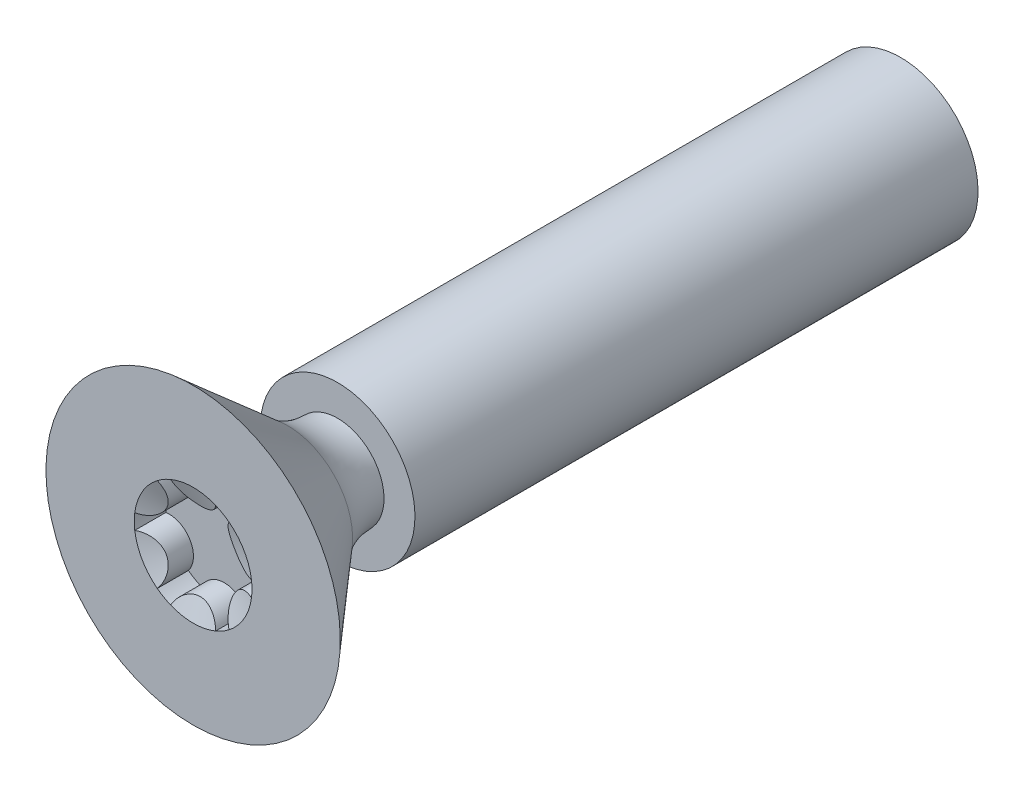
ISO-10303-21;
HEADER;
FILE_DESCRIPTION(('STEP AP214'),'2;1');
FILE_NAME('part.step','',(''),(''),'','','');
FILE_SCHEMA(('AUTOMOTIVE_DESIGN { 1 0 10303 214 1 1 1 1 }'));
ENDSEC;
DATA;
#1=APPLICATION_CONTEXT('core data for automotive mechanical design processes');
#2=APPLICATION_PROTOCOL_DEFINITION('international standard','automotive_design',2000,#1);
#3=PRODUCT_CONTEXT('',#1,'mechanical');
#4=PRODUCT('Part','Part','',(#3));
#5=PRODUCT_RELATED_PRODUCT_CATEGORY('part','',(#4));
#6=PRODUCT_DEFINITION_FORMATION('','',#4);
#7=PRODUCT_DEFINITION_CONTEXT('part definition',#1,'design');
#8=PRODUCT_DEFINITION('design','',#6,#7);
#9=PRODUCT_DEFINITION_SHAPE('','',#8);
#10=(LENGTH_UNIT() NAMED_UNIT(*) SI_UNIT(.MILLI.,.METRE.));
#11=(NAMED_UNIT(*) PLANE_ANGLE_UNIT() SI_UNIT($,.RADIAN.));
#12=(NAMED_UNIT(*) SI_UNIT($,.STERADIAN.) SOLID_ANGLE_UNIT());
#13=UNCERTAINTY_MEASURE_WITH_UNIT(LENGTH_MEASURE(1.E-05),#10,'distance_accuracy_value','');
#14=(GEOMETRIC_REPRESENTATION_CONTEXT(3) GLOBAL_UNCERTAINTY_ASSIGNED_CONTEXT((#13)) GLOBAL_UNIT_ASSIGNED_CONTEXT((#10,
#11,#12)) REPRESENTATION_CONTEXT('',''));
#15=CARTESIAN_POINT('',(0.,0.,0.));
#16=DIRECTION('',(0.,0.,1.));
#17=DIRECTION('',(1.,0.,0.));
#18=AXIS2_PLACEMENT_3D('',#15,#16,#17);
#19=CARTESIAN_POINT('',(0.,0.,-9.525));
#20=DIRECTION('',(0.,0.,1.));
#21=DIRECTION('',(0.,-1.,0.));
#22=AXIS2_PLACEMENT_3D('',#19,#20,#21);
#23=PLANE('',#22);
#24=CARTESIAN_POINT('',(0.,0.,-9.525));
#25=DIRECTION('',(0.,0.,1.));
#26=DIRECTION('',(0.,-1.,0.));
#27=AXIS2_PLACEMENT_3D('',#24,#25,#26);
#28=CIRCLE('',#27,2.08280000000001);
#29=CARTESIAN_POINT('',(0.,-2.08280000000002,-9.525));
#30=VERTEX_POINT('',#29);
#31=EDGE_CURVE('E51',#30,#30,#28,.T.);
#32=ORIENTED_EDGE('',*,*,#31,.F.);
#33=EDGE_LOOP('',(#32));
#34=FACE_BOUND('',#33,.T.);
#35=ADVANCED_FACE('F37',(#34),#23,.F.);
#36=CARTESIAN_POINT('',(0.,0.,9.525));
#37=DIRECTION('',(0.,0.,1.));
#38=DIRECTION('',(0.,-1.,0.));
#39=AXIS2_PLACEMENT_3D('',#36,#37,#38);
#40=CYLINDRICAL_SURFACE('',#39,2.08280000000001);
#41=CARTESIAN_POINT('',(0.,0.,5.63503378410079));
#42=DIRECTION('',(0.,0.,1.));
#43=DIRECTION('',(0.,-1.,0.));
#44=AXIS2_PLACEMENT_3D('',#41,#42,#43);
#45=CIRCLE('',#44,2.0828);
#46=CARTESIAN_POINT('',(0.,-2.08280000000001,5.63503378410079));
#47=VERTEX_POINT('',#46);
#48=EDGE_CURVE('E199',#47,#47,#45,.T.);
#49=ORIENTED_EDGE('',*,*,#48,.F.);
#50=EDGE_LOOP('',(#49));
#51=FACE_BOUND('',#50,.T.);
#52=ORIENTED_EDGE('',*,*,#31,.T.);
#53=EDGE_LOOP('',(#52));
#54=FACE_BOUND('',#53,.T.);
#55=ADVANCED_FACE('F204',(#51,#54),#40,.T.);
#56=CARTESIAN_POINT('',(0.,2.0828,5.63503378410079));
#57=DIRECTION('',(0.,0.,-1.));
#58=DIRECTION('',(0.,1.,0.));
#59=AXIS2_PLACEMENT_3D('',#56,#57,#58);
#60=PLANE('',#59);
#61=CARTESIAN_POINT('',(0.,0.,5.63503378410079));
#62=DIRECTION('',(0.,0.,1.));
#63=DIRECTION('',(0.,-1.,0.));
#64=AXIS2_PLACEMENT_3D('',#61,#62,#63);
#65=CIRCLE('',#64,1.24968000000001);
#66=CARTESIAN_POINT('',(0.,-1.24968000000002,5.63503378410079));
#67=VERTEX_POINT('',#66);
#68=EDGE_CURVE('E196',#67,#67,#65,.T.);
#69=ORIENTED_EDGE('',*,*,#68,.F.);
#70=EDGE_LOOP('',(#69));
#71=FACE_BOUND('',#70,.T.);
#72=ORIENTED_EDGE('',*,*,#48,.T.);
#73=EDGE_LOOP('',(#72));
#74=FACE_BOUND('',#73,.T.);
#75=ADVANCED_FACE('F210',(#71,#74),#60,.F.);
#76=CARTESIAN_POINT('',(0.,0.,5.63503378410079));
#77=DIRECTION('',(0.,0.,1.));
#78=DIRECTION('',(0.,-1.,0.));
#79=AXIS2_PLACEMENT_3D('',#76,#77,#78);
#80=TOROIDAL_SURFACE('',#79,3.30737017153296,2.05769017153295);
#81=CARTESIAN_POINT('',(0.,0.,6.985));
#82=DIRECTION('',(0.,0.,1.));
#83=DIRECTION('',(0.,-1.,0.));
#84=AXIS2_PLACEMENT_3D('',#81,#82,#83);
#85=CIRCLE('',#84,1.7544116859468);
#86=CARTESIAN_POINT('',(0.,-1.75441168594681,6.985));
#87=VERTEX_POINT('',#86);
#88=EDGE_CURVE('E193',#87,#87,#85,.T.);
#89=ORIENTED_EDGE('',*,*,#88,.F.);
#90=EDGE_LOOP('',(#89));
#91=FACE_BOUND('',#90,.T.);
#92=ORIENTED_EDGE('',*,*,#68,.T.);
#93=EDGE_LOOP('',(#92));
#94=FACE_BOUND('',#93,.T.);
#95=ADVANCED_FACE('F215',(#91,#94),#80,.F.);
#96=CARTESIAN_POINT('',(0.,0.,6.985));
#97=DIRECTION('',(0.,0.,1.));
#98=DIRECTION('',(0.,-1.,0.));
#99=AXIS2_PLACEMENT_3D('',#96,#97,#98);
#100=CONICAL_SURFACE('',#99,1.7544116859468,0.715584993317673);
#101=CARTESIAN_POINT('',(0.,0.,9.525));
#102=DIRECTION('',(0.,0.,1.));
#103=DIRECTION('',(0.,-1.,0.));
#104=AXIS2_PLACEMENT_3D('',#101,#102,#103);
#105=CIRCLE('',#104,3.96240000000001);
#106=CARTESIAN_POINT('',(0.,-3.96240000000001,9.525));
#107=VERTEX_POINT('',#106);
#108=EDGE_CURVE('E188',#107,#107,#105,.T.);
#109=ORIENTED_EDGE('',*,*,#108,.F.);
#110=EDGE_LOOP('',(#109));
#111=FACE_BOUND('',#110,.T.);
#112=ORIENTED_EDGE('',*,*,#88,.T.);
#113=EDGE_LOOP('',(#112));
#114=FACE_BOUND('',#113,.T.);
#115=ADVANCED_FACE('F222',(#111,#114),#100,.T.);
#116=CARTESIAN_POINT('',(0.,3.9624,9.525));
#117=DIRECTION('',(0.,0.,-1.));
#118=DIRECTION('',(0.,1.,0.));
#119=AXIS2_PLACEMENT_3D('',#116,#117,#118);
#120=PLANE('',#119);
#121=CARTESIAN_POINT('',(0.,0.,9.525));
#122=DIRECTION('',(0.,0.,1.));
#123=DIRECTION('',(1.,0.,0.));
#124=AXIS2_PLACEMENT_3D('',#121,#122,#123);
#125=CIRCLE('',#124,1.58496);
#126=CARTESIAN_POINT('',(0.964862514521663,1.257433310228,9.525));
#127=VERTEX_POINT('',#126);
#128=CARTESIAN_POINT('',(0.606537932961372,1.46431210384909,9.525));
#129=VERTEX_POINT('',#128);
#130=EDGE_CURVE('E147',#127,#129,#125,.T.);
#131=ORIENTED_EDGE('',*,*,#130,.F.);
#132=CARTESIAN_POINT('',(0.,0.,9.525));
#133=DIRECTION('',(0.,0.,1.));
#134=DIRECTION('',(1.,0.,0.));
#135=AXIS2_PLACEMENT_3D('',#132,#133,#134);
#136=CIRCLE('',#135,1.58496);
#137=CARTESIAN_POINT('',(1.57140044748303,0.206878793621089,9.525));
#138=VERTEX_POINT('',#137);
#139=EDGE_CURVE('E130',#138,#127,#136,.T.);
#140=ORIENTED_EDGE('',*,*,#139,.F.);
#141=CARTESIAN_POINT('',(0.,0.,9.525));
#142=DIRECTION('',(0.,0.,1.));
#143=DIRECTION('',(0.499999999999998,-0.86602540378444,0.));
#144=AXIS2_PLACEMENT_3D('',#141,#142,#143);
#145=CIRCLE('',#144,1.58496);
#146=CARTESIAN_POINT('',(1.57140044748303,-0.206878793621098,9.525));
#147=VERTEX_POINT('',#146);
#148=EDGE_CURVE('E144',#147,#138,#145,.T.);
#149=ORIENTED_EDGE('',*,*,#148,.F.);
#150=CARTESIAN_POINT('',(0.964862514521656,-1.257433310228,9.525));
#151=VERTEX_POINT('',#150);
#152=EDGE_CURVE('E152',#151,#147,#136,.T.);
#153=ORIENTED_EDGE('',*,*,#152,.F.);
#154=CARTESIAN_POINT('',(0.,0.,9.525));
#155=DIRECTION('',(0.,0.,1.));
#156=DIRECTION('',(-0.500000000000004,-0.866025403784436,0.));
#157=AXIS2_PLACEMENT_3D('',#154,#155,#156);
#158=CIRCLE('',#157,1.58496);
#159=CARTESIAN_POINT('',(0.606537932961375,-1.46431210384909,9.525));
#160=VERTEX_POINT('',#159);
#161=EDGE_CURVE('E314',#160,#151,#158,.T.);
#162=ORIENTED_EDGE('',*,*,#161,.F.);
#163=CARTESIAN_POINT('',(-0.606537932961372,-1.46431210384909,9.525));
#164=VERTEX_POINT('',#163);
#165=EDGE_CURVE('E315',#164,#160,#136,.T.);
#166=ORIENTED_EDGE('',*,*,#165,.F.);
#167=CARTESIAN_POINT('',(0.,0.,9.525));
#168=DIRECTION('',(0.,0.,1.));
#169=DIRECTION('',(-1.,0.,0.));
#170=AXIS2_PLACEMENT_3D('',#167,#168,#169);
#171=CIRCLE('',#170,1.58496);
#172=CARTESIAN_POINT('',(-0.964862514521672,-1.25743331022799,9.525));
#173=VERTEX_POINT('',#172);
#174=EDGE_CURVE('E349',#173,#164,#171,.T.);
#175=ORIENTED_EDGE('',*,*,#174,.F.);
#176=CARTESIAN_POINT('',(-1.57140044748304,-0.206878793621078,9.525));
#177=VERTEX_POINT('',#176);
#178=EDGE_CURVE('E316',#177,#173,#136,.T.);
#179=ORIENTED_EDGE('',*,*,#178,.F.);
#180=CARTESIAN_POINT('',(0.,0.,9.525));
#181=DIRECTION('',(0.,0.,1.));
#182=DIRECTION('',(-0.499999999999992,0.866025403784443,0.));
#183=AXIS2_PLACEMENT_3D('',#180,#181,#182);
#184=CIRCLE('',#183,1.58496);
#185=CARTESIAN_POINT('',(-1.57140044748303,0.206878793621109,9.525));
#186=VERTEX_POINT('',#185);
#187=EDGE_CURVE('E332',#186,#177,#184,.T.);
#188=ORIENTED_EDGE('',*,*,#187,.F.);
#189=CARTESIAN_POINT('',(-0.964862514521647,1.25743331022801,9.525));
#190=VERTEX_POINT('',#189);
#191=EDGE_CURVE('E319',#190,#186,#136,.T.);
#192=ORIENTED_EDGE('',*,*,#191,.F.);
#193=CARTESIAN_POINT('',(0.,0.,9.525));
#194=DIRECTION('',(0.,0.,1.));
#195=DIRECTION('',(1.,0.,0.));
#196=AXIS2_PLACEMENT_3D('',#193,#194,#195);
#197=CIRCLE('',#196,1.58496);
#198=CARTESIAN_POINT('',(-0.606537932961375,1.46431210384909,9.525));
#199=VERTEX_POINT('',#198);
#200=EDGE_CURVE('E178',#199,#190,#197,.T.);
#201=ORIENTED_EDGE('',*,*,#200,.F.);
#202=EDGE_CURVE('E150',#129,#199,#136,.T.);
#203=ORIENTED_EDGE('',*,*,#202,.F.);
#204=EDGE_LOOP('',(#131,#140,#149,#153,#162,#166,#175,#179,#188,#192,#201,#203));
#205=FACE_BOUND('',#204,.T.);
#206=ORIENTED_EDGE('',*,*,#108,.T.);
#207=EDGE_LOOP('',(#206));
#208=FACE_BOUND('',#207,.T.);
#209=ADVANCED_FACE('F140',(#205,#208),#120,.F.);
#210=CARTESIAN_POINT('',(0.,0.,8.6868));
#211=DIRECTION('',(0.,0.,1.));
#212=DIRECTION('',(1.,0.,0.));
#213=AXIS2_PLACEMENT_3D('',#210,#211,#212);
#214=CYLINDRICAL_SURFACE('',#213,1.58496);
#215=ORIENTED_EDGE('',*,*,#200,.T.);
#216=DIRECTION('',(0.,0.,1.));
#217=VECTOR('',#216,1.);
#218=CARTESIAN_POINT('',(-0.964862514521647,1.25743331022801,8.6868));
#219=LINE('',#218,#217);
#220=CARTESIAN_POINT('',(-0.964862514521647,1.25743331022801,8.6868));
#221=VERTEX_POINT('',#220);
#222=EDGE_CURVE('E343',#221,#190,#219,.T.);
#223=ORIENTED_EDGE('',*,*,#222,.F.);
#224=CARTESIAN_POINT('',(0.,0.,8.6868));
#225=DIRECTION('',(0.,0.,1.));
#226=DIRECTION('',(1.,0.,0.));
#227=AXIS2_PLACEMENT_3D('',#224,#225,#226);
#228=CIRCLE('',#227,1.58496);
#229=CARTESIAN_POINT('',(-0.606537932961375,1.46431210384909,8.6868));
#230=VERTEX_POINT('',#229);
#231=EDGE_CURVE('E181',#230,#221,#228,.T.);
#232=ORIENTED_EDGE('',*,*,#231,.F.);
#233=DIRECTION('',(0.,0.,1.));
#234=VECTOR('',#233,1.);
#235=CARTESIAN_POINT('',(-0.606537932961375,1.46431210384909,8.6868));
#236=LINE('',#235,#234);
#237=EDGE_CURVE('E58',#230,#199,#236,.T.);
#238=ORIENTED_EDGE('',*,*,#237,.T.);
#239=EDGE_LOOP('',(#215,#223,#232,#238));
#240=FACE_BOUND('',#239,.T.);
#241=ADVANCED_FACE('F229',(#240),#214,.F.);
#242=CARTESIAN_POINT('',(0.,1.71554834177543,8.6868));
#243=DIRECTION('',(0.,0.,1.));
#244=DIRECTION('',(1.,0.,0.));
#245=AXIS2_PLACEMENT_3D('',#242,#243,#244);
#246=CYLINDRICAL_SURFACE('',#245,0.656511927818862);
#247=DIRECTION('',(0.,0.,1.));
#248=VECTOR('',#247,1.);
#249=CARTESIAN_POINT('',(0.606537932961372,1.46431210384909,8.6868));
#250=LINE('',#249,#248);
#251=CARTESIAN_POINT('',(0.606537932961372,1.46431210384909,8.6868));
#252=VERTEX_POINT('',#251);
#253=EDGE_CURVE('E183',#252,#129,#250,.T.);
#254=ORIENTED_EDGE('',*,*,#253,.T.);
#255=CARTESIAN_POINT('',(0.606620737047647,1.4645121038491,9.52507878632848));
#256=CARTESIAN_POINT('',(0.591899974831452,1.42889640744862,9.51107584944854));
#257=CARTESIAN_POINT('',(0.574015744537299,1.39459591514082,9.49702913115426));
#258=CARTESIAN_POINT('',(0.53237347142213,1.32944028447298,9.46934068549851));
#259=CARTESIAN_POINT('',(0.508599804935802,1.29859463249072,9.45570014525806));
#260=CARTESIAN_POINT('',(0.455684489202386,1.24133009687709,9.4293816556536));
#261=CARTESIAN_POINT('',(0.426536443157783,1.2149165608469,9.41670487906433));
#262=CARTESIAN_POINT('',(0.363546962112956,1.16746668910544,9.39309530952745));
#263=CARTESIAN_POINT('',(0.329709535859555,1.14642580376133,9.38216104396763));
#264=CARTESIAN_POINT('',(0.259980041081726,1.11151189004277,9.3634686733045));
#265=CARTESIAN_POINT('',(0.224280688507839,1.09732810305881,9.35557705472131));
#266=CARTESIAN_POINT('',(0.150425702588726,1.07534624324804,9.34312947128857));
#267=CARTESIAN_POINT('',(0.112273360478411,1.06753979899499,9.33856913435916));
#268=CARTESIAN_POINT('',(0.0397175087205008,1.0593509503334,9.333771491522));
#269=CARTESIAN_POINT('',(0.00543354951431004,1.05817014081008,9.33306949651309));
#270=CARTESIAN_POINT('',(-0.0628146847864733,1.06115710753874,9.33482869448749));
#271=CARTESIAN_POINT('',(-0.0967790152509861,1.06532393956396,9.33728932904913));
#272=CARTESIAN_POINT('',(-0.161208322950086,1.07834175271004,9.34481442212741));
#273=CARTESIAN_POINT('',(-0.191758705608758,1.08687945113516,9.34970415433325));
#274=CARTESIAN_POINT('',(-0.250963101796016,1.10808251203587,9.36152878880998));
#275=CARTESIAN_POINT('',(-0.279616743541796,1.12074868087331,9.36846409059089));
#276=CARTESIAN_POINT('',(-0.336732987635439,1.15097274779104,9.38451007048393));
#277=CARTESIAN_POINT('',(-0.364992824401218,1.16884335823223,9.39375129781088));
#278=CARTESIAN_POINT('',(-0.418226123731949,1.20840337081226,9.41348967391742));
#279=CARTESIAN_POINT('',(-0.443196720684921,1.23009606482622,9.42398790280646));
#280=CARTESIAN_POINT('',(-0.492176752514586,1.27952183583867,9.44706426936941));
#281=CARTESIAN_POINT('',(-0.515725170594541,1.30766561673778,9.45974166421436));
#282=CARTESIAN_POINT('',(-0.557710344264225,1.3672777425278,9.48556895422858));
#283=CARTESIAN_POINT('',(-0.576155467677905,1.39874052683391,9.49871803549398));
#284=CARTESIAN_POINT('',(-0.597087327272507,1.44234270079717,9.51629652958411));
#285=CARTESIAN_POINT('',(-0.602009389071151,1.45336579093559,9.52068913611094));
#286=CARTESIAN_POINT('',(-0.60662073704765,1.4645121038491,9.52507878632848));
#287=B_SPLINE_CURVE_WITH_KNOTS('',3,(#255,#256,#257,#258,#259,#260,#261,#262,#263,#264,#265,
#266,#267,#268,#269,#270,#271,#272,#273,#274,#275,#276,#277,#278,#279,#280,#281,#282,#283,#284,
#285,#286),.UNSPECIFIED.,.F.,.F.,(4,2,2,2,2,2,2,2,2,2,2,2,2,2,2,4),(0.,0.122886114295661,
0.246101782428359,0.369465064653611,0.492723532130329,0.609697652485102,0.726517975105132,
0.828898189006218,0.931260328240385,1.02714137240356,1.12304115503029,1.22669481558588,
1.33043819105557,1.44642190862391,1.56221430624871,1.60073455529561),.UNSPECIFIED.);
#288=EDGE_CURVE('E135',#129,#199,#287,.T.);
#289=ORIENTED_EDGE('',*,*,#288,.T.);
#290=ORIENTED_EDGE('',*,*,#237,.F.);
#291=CARTESIAN_POINT('',(0.,1.71554834177543,8.6868));
#292=DIRECTION('',(0.,0.,-1.));
#293=DIRECTION('',(1.,0.,0.));
#294=AXIS2_PLACEMENT_3D('',#291,#292,#293);
#295=CIRCLE('',#294,0.656511927818862);
#296=EDGE_CURVE('E177',#252,#230,#295,.T.);
#297=ORIENTED_EDGE('',*,*,#296,.F.);
#298=EDGE_LOOP('',(#254,#289,#290,#297));
#299=FACE_BOUND('',#298,.T.);
#300=ADVANCED_FACE('F234',(#299),#246,.T.);
#301=CARTESIAN_POINT('',(0.,0.,8.6868));
#302=DIRECTION('',(0.,0.,1.));
#303=DIRECTION('',(1.,0.,0.));
#304=AXIS2_PLACEMENT_3D('',#301,#302,#303);
#305=CYLINDRICAL_SURFACE('',#304,1.58496);
#306=ORIENTED_EDGE('',*,*,#130,.T.);
#307=ORIENTED_EDGE('',*,*,#253,.F.);
#308=CARTESIAN_POINT('',(0.,0.,8.6868));
#309=DIRECTION('',(0.,0.,1.));
#310=DIRECTION('',(1.,0.,0.));
#311=AXIS2_PLACEMENT_3D('',#308,#309,#310);
#312=CIRCLE('',#311,1.58496);
#313=CARTESIAN_POINT('',(0.964862514521663,1.257433310228,8.6868));
#314=VERTEX_POINT('',#313);
#315=EDGE_CURVE('E174',#314,#252,#312,.T.);
#316=ORIENTED_EDGE('',*,*,#315,.F.);
#317=DIRECTION('',(0.,0.,1.));
#318=VECTOR('',#317,1.);
#319=CARTESIAN_POINT('',(0.964862514521663,1.257433310228,8.6868));
#320=LINE('',#319,#318);
#321=EDGE_CURVE('E160',#314,#127,#320,.T.);
#322=ORIENTED_EDGE('',*,*,#321,.T.);
#323=EDGE_LOOP('',(#306,#307,#316,#322));
#324=FACE_BOUND('',#323,.T.);
#325=ADVANCED_FACE('F230',(#324),#305,.F.);
#326=CARTESIAN_POINT('',(0.,0.,8.6868));
#327=DIRECTION('',(0.,0.,1.));
#328=DIRECTION('',(1.,0.,0.));
#329=AXIS2_PLACEMENT_3D('',#326,#327,#328);
#330=PLANE('',#329);
#331=CARTESIAN_POINT('',(1.48570844539779,0.857774170887714,8.6868));
#332=DIRECTION('',(0.,0.,-1.));
#333=DIRECTION('',(0.499999999999998,-0.86602540378444,0.));
#334=AXIS2_PLACEMENT_3D('',#331,#332,#333);
#335=CIRCLE('',#334,0.656511927818862);
#336=CARTESIAN_POINT('',(1.57140044748303,0.206878793621089,8.6868));
#337=VERTEX_POINT('',#336);
#338=EDGE_CURVE('E157',#337,#314,#335,.T.);
#339=ORIENTED_EDGE('',*,*,#338,.T.);
#340=ORIENTED_EDGE('',*,*,#315,.T.);
#341=ORIENTED_EDGE('',*,*,#296,.T.);
#342=ORIENTED_EDGE('',*,*,#231,.T.);
#343=CARTESIAN_POINT('',(-1.48570844539778,0.857774170887733,8.6868));
#344=DIRECTION('',(0.,0.,-1.));
#345=DIRECTION('',(0.50000000000001,0.866025403784433,0.));
#346=AXIS2_PLACEMENT_3D('',#343,#344,#345);
#347=CIRCLE('',#346,0.656511927818862);
#348=CARTESIAN_POINT('',(-1.57140044748303,0.206878793621109,8.6868));
#349=VERTEX_POINT('',#348);
#350=EDGE_CURVE('E246',#221,#349,#347,.T.);
#351=ORIENTED_EDGE('',*,*,#350,.T.);
#352=CARTESIAN_POINT('',(0.,0.,8.6868));
#353=DIRECTION('',(0.,0.,1.));
#354=DIRECTION('',(-0.499999999999992,0.866025403784443,0.));
#355=AXIS2_PLACEMENT_3D('',#352,#353,#354);
#356=CIRCLE('',#355,1.58496);
#357=CARTESIAN_POINT('',(-1.57140044748304,-0.206878793621078,8.6868));
#358=VERTEX_POINT('',#357);
#359=EDGE_CURVE('E337',#349,#358,#356,.T.);
#360=ORIENTED_EDGE('',*,*,#359,.T.);
#361=CARTESIAN_POINT('',(-1.4857084453978,-0.857774170887704,8.6868));
#362=DIRECTION('',(0.,0.,-1.));
#363=DIRECTION('',(-0.499999999999992,0.866025403784443,0.));
#364=AXIS2_PLACEMENT_3D('',#361,#362,#363);
#365=CIRCLE('',#364,0.656511927818862);
#366=CARTESIAN_POINT('',(-0.964862514521672,-1.25743331022799,8.6868));
#367=VERTEX_POINT('',#366);
#368=EDGE_CURVE('E341',#358,#367,#365,.T.);
#369=ORIENTED_EDGE('',*,*,#368,.T.);
#370=CARTESIAN_POINT('',(0.,0.,8.6868));
#371=DIRECTION('',(0.,0.,1.));
#372=DIRECTION('',(-1.,0.,0.));
#373=AXIS2_PLACEMENT_3D('',#370,#371,#372);
#374=CIRCLE('',#373,1.58496);
#375=CARTESIAN_POINT('',(-0.606537932961372,-1.46431210384909,8.6868));
#376=VERTEX_POINT('',#375);
#377=EDGE_CURVE('E352',#367,#376,#374,.T.);
#378=ORIENTED_EDGE('',*,*,#377,.T.);
#379=CARTESIAN_POINT('',(0.,-1.71554834177543,8.6868));
#380=DIRECTION('',(0.,0.,-1.));
#381=DIRECTION('',(-1.,0.,0.));
#382=AXIS2_PLACEMENT_3D('',#379,#380,#381);
#383=CIRCLE('',#382,0.656511927818862);
#384=CARTESIAN_POINT('',(0.606537932961375,-1.46431210384909,8.6868));
#385=VERTEX_POINT('',#384);
#386=EDGE_CURVE('E355',#376,#385,#383,.T.);
#387=ORIENTED_EDGE('',*,*,#386,.T.);
#388=CARTESIAN_POINT('',(0.,0.,8.6868));
#389=DIRECTION('',(0.,0.,1.));
#390=DIRECTION('',(-0.500000000000004,-0.866025403784436,0.));
#391=AXIS2_PLACEMENT_3D('',#388,#389,#390);
#392=CIRCLE('',#391,1.58496);
#393=CARTESIAN_POINT('',(0.964862514521656,-1.257433310228,8.6868));
#394=VERTEX_POINT('',#393);
#395=EDGE_CURVE('E366',#385,#394,#392,.T.);
#396=ORIENTED_EDGE('',*,*,#395,.T.);
#397=CARTESIAN_POINT('',(1.48570844539779,-0.857774170887722,8.6868));
#398=DIRECTION('',(0.,0.,-1.));
#399=DIRECTION('',(-0.500000000000004,-0.866025403784436,0.));
#400=AXIS2_PLACEMENT_3D('',#397,#398,#399);
#401=CIRCLE('',#400,0.656511927818862);
#402=CARTESIAN_POINT('',(1.57140044748303,-0.206878793621098,8.6868));
#403=VERTEX_POINT('',#402);
#404=EDGE_CURVE('E307',#394,#403,#401,.T.);
#405=ORIENTED_EDGE('',*,*,#404,.T.);
#406=CARTESIAN_POINT('',(0.,0.,8.6868));
#407=DIRECTION('',(0.,0.,1.));
#408=DIRECTION('',(0.499999999999998,-0.86602540378444,0.));
#409=AXIS2_PLACEMENT_3D('',#406,#407,#408);
#410=CIRCLE('',#409,1.58496);
#411=EDGE_CURVE('E166',#403,#337,#410,.T.);
#412=ORIENTED_EDGE('',*,*,#411,.T.);
#413=EDGE_LOOP('',(#339,#340,#341,#342,#351,#360,#369,#378,#387,#396,#405,#412));
#414=FACE_BOUND('',#413,.T.);
#415=ADVANCED_FACE('F233',(#414),#330,.T.);
#416=CARTESIAN_POINT('',(1.48570844539779,0.857774170887714,8.6868));
#417=DIRECTION('',(0.,0.,1.));
#418=DIRECTION('',(1.,0.,0.));
#419=AXIS2_PLACEMENT_3D('',#416,#417,#418);
#420=CYLINDRICAL_SURFACE('',#419,0.656511927818862);
#421=DIRECTION('',(0.,0.,1.));
#422=VECTOR('',#421,1.);
#423=CARTESIAN_POINT('',(1.57140044748303,0.206878793621089,8.6868));
#424=LINE('',#423,#422);
#425=EDGE_CURVE('E154',#337,#138,#424,.T.);
#426=ORIENTED_EDGE('',*,*,#425,.T.);
#427=CARTESIAN_POINT('',(1.57160044748303,0.206905155381347,9.52507342366894));
#428=CARTESIAN_POINT('',(1.53339596439884,0.201846733462941,9.51107052737668));
#429=CARTESIAN_POINT('',(1.49474881550115,0.20018554588693,9.49702387243406));
#430=CARTESIAN_POINT('',(1.41750149278717,0.203672687421221,9.46933560847295));
#431=CARTESIAN_POINT('',(1.37890172297067,0.208839292110661,9.45569518686263));
#432=CARTESIAN_POINT('',(1.30285200415728,0.22603465566034,9.42937700654536));
#433=CARTESIAN_POINT('',(1.26540348818721,0.238071628754191,9.41670042079987));
#434=CARTESIAN_POINT('',(1.19281668128308,0.268898714580023,9.39309132774576));
#435=CARTESIAN_POINT('',(1.15767645421489,0.287683079955932,9.38215734751313));
#436=CARTESIAN_POINT('',(1.09257644913887,0.330614918381839,9.3634656723702));
#437=CARTESIAN_POINT('',(1.06244388605663,0.354440097313536,9.35557444955442));
#438=CARTESIAN_POINT('',(1.00648089477467,0.40741036260654,9.34312771634253));
#439=CARTESIAN_POINT('',(0.980644862267754,0.436548413230223,9.33856783383223));
#440=CARTESIAN_POINT('',(0.93727661096769,0.49528968327666,9.33377104513734));
#441=CARTESIAN_POINT('',(0.919112716002118,0.524390183661399,9.33306944549036));
#442=CARTESIAN_POINT('',(0.887576760577468,0.584988465380296,9.33482936967582));
#443=CARTESIAN_POINT('',(0.874203855084532,0.616485822767858,9.33729033534397));
#444=CARTESIAN_POINT('',(0.85326412257871,0.678792219951655,9.3448160081291));
#445=CARTESIAN_POINT('',(0.845383324903808,0.70951860001507,9.3497060165735));
#446=CARTESIAN_POINT('',(0.834144579449489,0.771392804366783,9.36153114877431));
#447=CARTESIAN_POINT('',(0.83078751598219,0.8025407098544,9.36846667207077));
#448=CARTESIAN_POINT('',(0.828405297309912,0.867117064853005,9.38451310470694));
#449=CARTESIAN_POINT('',(0.829752371031226,0.900526262889412,9.39375456921559));
#450=CARTESIAN_POINT('',(0.837396914388823,0.966407880385732,9.41349337549271));
#451=CARTESIAN_POINT('',(0.843698667290685,0.99887946409618,9.42399179722682));
#452=CARTESIAN_POINT('',(0.862013970653221,1.06601029481467,9.44706851372376));
#453=CARTESIAN_POINT('',(0.87461370499383,1.10047563292125,9.45974605937357));
#454=CARTESIAN_POINT('',(0.905248169778303,1.16664165121236,9.48557360645127));
#455=CARTESIAN_POINT('',(0.923273902695396,1.19834679706288,9.49872279423692));
#456=CARTESIAN_POINT('',(0.950573693507944,1.23828117050207,9.51630409148055));
#457=CARTESIAN_POINT('',(0.957663674476363,1.24806111148701,9.52069941280622));
#458=CARTESIAN_POINT('',(0.96501604094533,1.257633310228,9.52509176840957));
#459=B_SPLINE_CURVE_WITH_KNOTS('',3,(#427,#428,#429,#430,#431,#432,#433,#434,#435,#436,#437,
#438,#439,#440,#441,#442,#443,#444,#445,#446,#447,#448,#449,#450,#451,#452,#453,#454,#455,#456,
#457,#458),.UNSPECIFIED.,.F.,.F.,(4,2,2,2,2,2,2,2,2,2,2,2,2,2,2,4),(0.,0.122885766375418,
0.246101121500331,0.36946410279625,0.492722253046518,0.609695634783576,0.726515221292399,
0.828894637308939,0.931255986762043,1.0271371247448,1.12303700312084,1.22669136933226,
1.33043544225961,1.44641977793977,1.56221283518298,1.60075683029764),.UNSPECIFIED.);
#460=EDGE_CURVE('E127',#138,#127,#459,.T.);
#461=ORIENTED_EDGE('',*,*,#460,.T.);
#462=ORIENTED_EDGE('',*,*,#321,.F.);
#463=ORIENTED_EDGE('',*,*,#338,.F.);
#464=EDGE_LOOP('',(#426,#461,#462,#463));
#465=FACE_BOUND('',#464,.T.);
#466=ADVANCED_FACE('F155',(#465),#420,.T.);
#467=CARTESIAN_POINT('',(0.,0.,8.6868));
#468=DIRECTION('',(0.,0.,1.));
#469=DIRECTION('',(1.,0.,0.));
#470=AXIS2_PLACEMENT_3D('',#467,#468,#469);
#471=CYLINDRICAL_SURFACE('',#470,1.58496);
#472=ORIENTED_EDGE('',*,*,#148,.T.);
#473=ORIENTED_EDGE('',*,*,#425,.F.);
#474=ORIENTED_EDGE('',*,*,#411,.F.);
#475=DIRECTION('',(0.,0.,1.));
#476=VECTOR('',#475,1.);
#477=CARTESIAN_POINT('',(1.57140044748303,-0.206878793621098,8.6868));
#478=LINE('',#477,#476);
#479=EDGE_CURVE('E165',#403,#147,#478,.T.);
#480=ORIENTED_EDGE('',*,*,#479,.T.);
#481=EDGE_LOOP('',(#472,#473,#474,#480));
#482=FACE_BOUND('',#481,.T.);
#483=ADVANCED_FACE('F163',(#482),#471,.F.);
#484=CARTESIAN_POINT('',(1.48570844539779,-0.857774170887722,8.6868));
#485=DIRECTION('',(0.,0.,1.));
#486=DIRECTION('',(0.,-1.,0.));
#487=AXIS2_PLACEMENT_3D('',#484,#485,#486);
#488=CYLINDRICAL_SURFACE('',#487,0.656511927818862);
#489=DIRECTION('',(0.,0.,1.));
#490=VECTOR('',#489,1.);
#491=CARTESIAN_POINT('',(0.964862514521656,-1.257433310228,8.6868));
#492=LINE('',#491,#490);
#493=EDGE_CURVE('E169',#394,#151,#492,.T.);
#494=ORIENTED_EDGE('',*,*,#493,.T.);
#495=CARTESIAN_POINT('',(0.965016040945324,-1.257633310228,9.52509176840957));
#496=CARTESIAN_POINT('',(0.941530500577438,-1.22707797248408,9.51108873330924));
#497=CARTESIAN_POINT('',(0.920765635951473,-1.19444043653207,9.49704186168867));
#498=CARTESIAN_POINT('',(0.885156500337642,-1.1258008871399,9.46935297627336));
#499=CARTESIAN_POINT('',(0.870328252169463,-1.08979008788569,9.45571214890425));
#500=CARTESIAN_POINT('',(0.847189380467055,-1.01533276823965,9.42939291067599));
#501=CARTESIAN_POINT('',(0.83888658481949,-0.97688338207782,9.41671567214001));
#502=CARTESIAN_POINT('',(0.829284440243286,-0.898608282603415,9.3931049492263));
#503=CARTESIAN_POINT('',(0.827979149150365,-0.858783765965396,9.38216999299136));
#504=CARTESIAN_POINT('',(0.832603568246803,-0.780938585388116,9.36347593868757));
#505=CARTESIAN_POINT('',(0.838167855171811,-0.74292945553158,9.3555833620559));
#506=CARTESIAN_POINT('',(0.856054974655709,-0.667976490915368,9.34313372040413));
#507=CARTESIAN_POINT('',(0.868368911248832,-0.631031321181975,9.33857228339401));
#508=CARTESIAN_POINT('',(0.89755234678354,-0.564099282486951,9.33377257274649));
#509=CARTESIAN_POINT('',(0.913670610164055,-0.533816791320206,9.3330696205974));
#510=CARTESIAN_POINT('',(0.950379658402857,-0.476202805619278,9.33482706048568));
#511=CARTESIAN_POINT('',(0.97096965224976,-0.448870790449264,9.33728689343122));
#512=CARTESIAN_POINT('',(1.01445649866512,-0.399579928332219,9.34481058290952));
#513=CARTESIAN_POINT('',(1.03712465277384,-0.377390409115796,9.34969964615135));
#514=CARTESIAN_POINT('',(1.08508761175442,-0.336717396029307,9.36152307551221));
#515=CARTESIAN_POINT('',(1.11038292916304,-0.318234627383338,9.3684578412175));
#516=CARTESIAN_POINT('',(1.16511411695806,-0.283880492218792,9.38450272677297));
#517=CARTESIAN_POINT('',(1.19471940202065,-0.268341012115795,9.39374338166316));
#518=CARTESIAN_POINT('',(1.25559408923867,-0.242017346993275,9.41348071637655));
#519=CARTESIAN_POINT('',(1.28686490937233,-0.231237288912695,9.42397847626109));
#520=CARTESIAN_POINT('',(1.35415725878211,-0.213529399977928,9.44705398767587));
#521=CARTESIAN_POINT('',(1.39030398321124,-0.207206169296688,9.45973101139824));
#522=CARTESIAN_POINT('',(1.46292100150314,-0.20064865803405,9.48555767189346));
#523=CARTESIAN_POINT('',(1.49939066344236,-0.200404353045098,9.49870649477777));
#524=CARTESIAN_POINT('',(1.54762275608162,-0.20407595368691,9.51628690588743));
#525=CARTESIAN_POINT('',(1.55963594298234,-0.205325044543862,9.52068164319188));
#526=CARTESIAN_POINT('',(1.57160044748303,-0.206905155381355,9.52507342366894));
#527=B_SPLINE_CURVE_WITH_KNOTS('',3,(#495,#496,#497,#498,#499,#500,#501,#502,#503,#504,#505,
#506,#507,#508,#509,#510,#511,#512,#513,#514,#515,#516,#517,#518,#519,#520,#521,#522,#523,#524,
#525,#526),.UNSPECIFIED.,.F.,.F.,(4,2,2,2,2,2,2,2,2,2,2,2,2,2,2,4),(0.,0.122886956465848,
0.246103382136821,0.369467392708654,0.492726628004529,0.609702536192569,0.726524640812616,
0.828906787172915,0.931270837725023,1.02715165149929,1.12305120605067,1.22670317480045,
1.33044484545505,1.44642699248326,1.56221786730978,1.60075681393548),.UNSPECIFIED.);
#528=EDGE_CURVE('E136',#151,#147,#527,.T.);
#529=ORIENTED_EDGE('',*,*,#528,.T.);
#530=ORIENTED_EDGE('',*,*,#479,.F.);
#531=ORIENTED_EDGE('',*,*,#404,.F.);
#532=EDGE_LOOP('',(#494,#529,#530,#531));
#533=FACE_BOUND('',#532,.T.);
#534=ADVANCED_FACE('F285',(#533),#488,.T.);
#535=CARTESIAN_POINT('',(0.,0.,8.6868));
#536=DIRECTION('',(0.,0.,1.));
#537=DIRECTION('',(0.,-1.,0.));
#538=AXIS2_PLACEMENT_3D('',#535,#536,#537);
#539=CYLINDRICAL_SURFACE('',#538,1.58496);
#540=ORIENTED_EDGE('',*,*,#161,.T.);
#541=ORIENTED_EDGE('',*,*,#493,.F.);
#542=ORIENTED_EDGE('',*,*,#395,.F.);
#543=DIRECTION('',(0.,0.,1.));
#544=VECTOR('',#543,1.);
#545=CARTESIAN_POINT('',(0.606537932961375,-1.46431210384909,8.6868));
#546=LINE('',#545,#544);
#547=EDGE_CURVE('E361',#385,#160,#546,.T.);
#548=ORIENTED_EDGE('',*,*,#547,.T.);
#549=EDGE_LOOP('',(#540,#541,#542,#548));
#550=FACE_BOUND('',#549,.T.);
#551=ADVANCED_FACE('F290',(#550),#539,.F.);
#552=CARTESIAN_POINT('',(0.,-1.71554834177543,8.6868));
#553=DIRECTION('',(0.,0.,1.));
#554=DIRECTION('',(0.,-1.,0.));
#555=AXIS2_PLACEMENT_3D('',#552,#553,#554);
#556=CYLINDRICAL_SURFACE('',#555,0.656511927818862);
#557=DIRECTION('',(0.,0.,1.));
#558=VECTOR('',#557,1.);
#559=CARTESIAN_POINT('',(-0.606537932961372,-1.46431210384909,8.6868));
#560=LINE('',#559,#558);
#561=EDGE_CURVE('E358',#376,#164,#560,.T.);
#562=ORIENTED_EDGE('',*,*,#561,.T.);
#563=CARTESIAN_POINT('',(-0.606620737047647,-1.4645121038491,9.52507878632848));
#564=CARTESIAN_POINT('',(-0.591899974831452,-1.42889640744862,9.51107584944854));
#565=CARTESIAN_POINT('',(-0.574015744537299,-1.39459591514082,9.49702913115426));
#566=CARTESIAN_POINT('',(-0.53237347142213,-1.32944028447298,9.46934068549851));
#567=CARTESIAN_POINT('',(-0.508599804935802,-1.29859463249072,9.45570014525806));
#568=CARTESIAN_POINT('',(-0.455684489202386,-1.24133009687709,9.4293816556536));
#569=CARTESIAN_POINT('',(-0.426536443157783,-1.2149165608469,9.41670487906433));
#570=CARTESIAN_POINT('',(-0.363546962112956,-1.16746668910544,9.39309530952745));
#571=CARTESIAN_POINT('',(-0.329709535859555,-1.14642580376133,9.38216104396763));
#572=CARTESIAN_POINT('',(-0.259980041081726,-1.11151189004277,9.3634686733045));
#573=CARTESIAN_POINT('',(-0.224280688507839,-1.09732810305881,9.35557705472131));
#574=CARTESIAN_POINT('',(-0.150425702588726,-1.07534624324804,9.34312947128857));
#575=CARTESIAN_POINT('',(-0.112273360478411,-1.06753979899499,9.33856913435916));
#576=CARTESIAN_POINT('',(-0.0397175087205008,-1.0593509503334,9.333771491522));
#577=CARTESIAN_POINT('',(-0.00543354951431004,-1.05817014081008,9.33306949651309));
#578=CARTESIAN_POINT('',(0.0628146847864733,-1.06115710753874,9.33482869448749));
#579=CARTESIAN_POINT('',(0.0967790152509861,-1.06532393956396,9.33728932904913));
#580=CARTESIAN_POINT('',(0.161208322950086,-1.07834175271004,9.34481442212741));
#581=CARTESIAN_POINT('',(0.191758705608758,-1.08687945113516,9.34970415433325));
#582=CARTESIAN_POINT('',(0.250963101796016,-1.10808251203587,9.36152878880998));
#583=CARTESIAN_POINT('',(0.279616743541796,-1.12074868087331,9.36846409059089));
#584=CARTESIAN_POINT('',(0.336732987635439,-1.15097274779104,9.38451007048393));
#585=CARTESIAN_POINT('',(0.364992824401218,-1.16884335823223,9.39375129781088));
#586=CARTESIAN_POINT('',(0.418226123731949,-1.20840337081226,9.41348967391742));
#587=CARTESIAN_POINT('',(0.443196720684921,-1.23009606482622,9.42398790280646));
#588=CARTESIAN_POINT('',(0.492176752514586,-1.27952183583867,9.44706426936941));
#589=CARTESIAN_POINT('',(0.515725170594541,-1.30766561673778,9.45974166421436));
#590=CARTESIAN_POINT('',(0.557710344264225,-1.3672777425278,9.48556895422858));
#591=CARTESIAN_POINT('',(0.576155467677905,-1.39874052683391,9.49871803549398));
#592=CARTESIAN_POINT('',(0.597087327272507,-1.44234270079717,9.51629652958411));
#593=CARTESIAN_POINT('',(0.602009389071151,-1.45336579093559,9.52068913611094));
#594=CARTESIAN_POINT('',(0.60662073704765,-1.4645121038491,9.52507878632848));
#595=B_SPLINE_CURVE_WITH_KNOTS('',3,(#563,#564,#565,#566,#567,#568,#569,#570,#571,#572,#573,
#574,#575,#576,#577,#578,#579,#580,#581,#582,#583,#584,#585,#586,#587,#588,#589,#590,#591,#592,
#593,#594),.UNSPECIFIED.,.F.,.F.,(4,2,2,2,2,2,2,2,2,2,2,2,2,2,2,4),(0.,0.122886114295661,
0.246101782428359,0.369465064653611,0.492723532130329,0.609697652485102,0.726517975105132,
0.828898189006218,0.931260328240385,1.02714137240356,1.12304115503029,1.22669481558588,
1.33043819105557,1.44642190862391,1.56221430624871,1.60073455529561),.UNSPECIFIED.);
#596=EDGE_CURVE('E273',#164,#160,#595,.T.);
#597=ORIENTED_EDGE('',*,*,#596,.T.);
#598=ORIENTED_EDGE('',*,*,#547,.F.);
#599=ORIENTED_EDGE('',*,*,#386,.F.);
#600=EDGE_LOOP('',(#562,#597,#598,#599));
#601=FACE_BOUND('',#600,.T.);
#602=ADVANCED_FACE('F294',(#601),#556,.T.);
#603=CARTESIAN_POINT('',(0.,0.,8.6868));
#604=DIRECTION('',(0.,0.,1.));
#605=DIRECTION('',(0.,-1.,0.));
#606=AXIS2_PLACEMENT_3D('',#603,#604,#605);
#607=CYLINDRICAL_SURFACE('',#606,1.58496);
#608=ORIENTED_EDGE('',*,*,#174,.T.);
#609=ORIENTED_EDGE('',*,*,#561,.F.);
#610=ORIENTED_EDGE('',*,*,#377,.F.);
#611=DIRECTION('',(0.,0.,1.));
#612=VECTOR('',#611,1.);
#613=CARTESIAN_POINT('',(-0.964862514521672,-1.25743331022799,8.6868));
#614=LINE('',#613,#612);
#615=EDGE_CURVE('E346',#367,#173,#614,.T.);
#616=ORIENTED_EDGE('',*,*,#615,.T.);
#617=EDGE_LOOP('',(#608,#609,#610,#616));
#618=FACE_BOUND('',#617,.T.);
#619=ADVANCED_FACE('F292',(#618),#607,.F.);
#620=CARTESIAN_POINT('',(-1.4857084453978,-0.857774170887704,8.6868));
#621=DIRECTION('',(0.,0.,1.));
#622=DIRECTION('',(0.,-1.,0.));
#623=AXIS2_PLACEMENT_3D('',#620,#621,#622);
#624=CYLINDRICAL_SURFACE('',#623,0.656511927818862);
#625=DIRECTION('',(0.,0.,1.));
#626=VECTOR('',#625,1.);
#627=CARTESIAN_POINT('',(-1.57140044748304,-0.206878793621078,8.6868));
#628=LINE('',#627,#626);
#629=EDGE_CURVE('E350',#358,#177,#628,.T.);
#630=ORIENTED_EDGE('',*,*,#629,.T.);
#631=CARTESIAN_POINT('',(-1.57160044748304,-0.206905155381336,9.52507342366894));
#632=CARTESIAN_POINT('',(-1.53339596439884,-0.201846733462931,9.51107052737668));
#633=CARTESIAN_POINT('',(-1.49474881550115,-0.20018554588692,9.49702387243406));
#634=CARTESIAN_POINT('',(-1.41750149278717,-0.203672687421211,9.46933560847295));
#635=CARTESIAN_POINT('',(-1.37890172297067,-0.208839292110652,9.45569518686263));
#636=CARTESIAN_POINT('',(-1.30285200415728,-0.226034655660331,9.42937700654536));
#637=CARTESIAN_POINT('',(-1.26540348818721,-0.238071628754182,9.41670042079987));
#638=CARTESIAN_POINT('',(-1.19281668128308,-0.268898714580015,9.39309132774576));
#639=CARTESIAN_POINT('',(-1.15767645421489,-0.287683079955924,9.38215734751313));
#640=CARTESIAN_POINT('',(-1.09257644913887,-0.330614918381832,9.3634656723702));
#641=CARTESIAN_POINT('',(-1.06244388605663,-0.354440097313529,9.35557444955442));
#642=CARTESIAN_POINT('',(-1.00648089477468,-0.407410362606533,9.34312771634253));
#643=CARTESIAN_POINT('',(-0.980644862267757,-0.436548413230217,9.33856783383223));
#644=CARTESIAN_POINT('',(-0.937276610967692,-0.495289683276654,9.33377104513734));
#645=CARTESIAN_POINT('',(-0.919112716002121,-0.524390183661393,9.33306944549036));
#646=CARTESIAN_POINT('',(-0.887576760577472,-0.584988465380291,9.33482936967582));
#647=CARTESIAN_POINT('',(-0.874203855084536,-0.616485822767852,9.33729033534397));
#648=CARTESIAN_POINT('',(-0.853264122578714,-0.67879221995165,9.3448160081291));
#649=CARTESIAN_POINT('',(-0.845383324903813,-0.709518600015066,9.3497060165735));
#650=CARTESIAN_POINT('',(-0.834144579449494,-0.771392804366779,9.36153114877431));
#651=CARTESIAN_POINT('',(-0.830787515982196,-0.802540709854395,9.36846667207077));
#652=CARTESIAN_POINT('',(-0.828405297309918,-0.867117064853,9.38451310470694));
#653=CARTESIAN_POINT('',(-0.829752371031232,-0.900526262889407,9.39375456921559));
#654=CARTESIAN_POINT('',(-0.83739691438883,-0.966407880385727,9.41349337549271));
#655=CARTESIAN_POINT('',(-0.843698667290692,-0.998879464096175,9.42399179722682));
#656=CARTESIAN_POINT('',(-0.862013970653228,-1.06601029481467,9.44706851372376));
#657=CARTESIAN_POINT('',(-0.874613704993838,-1.10047563292124,9.45974605937357));
#658=CARTESIAN_POINT('',(-0.905248169778311,-1.16664165121236,9.48557360645127));
#659=CARTESIAN_POINT('',(-0.923273902695404,-1.19834679706287,9.49872279423692));
#660=CARTESIAN_POINT('',(-0.950573693507953,-1.23828117050207,9.51630409148055));
#661=CARTESIAN_POINT('',(-0.957663674476372,-1.248061111487,9.52069941280622));
#662=CARTESIAN_POINT('',(-0.965016040945339,-1.25763331022799,9.52509176840957));
#663=B_SPLINE_CURVE_WITH_KNOTS('',3,(#631,#632,#633,#634,#635,#636,#637,#638,#639,#640,#641,
#642,#643,#644,#645,#646,#647,#648,#649,#650,#651,#652,#653,#654,#655,#656,#657,#658,#659,#660,
#661,#662),.UNSPECIFIED.,.F.,.F.,(4,2,2,2,2,2,2,2,2,2,2,2,2,2,2,4),(0.,0.122885766375419,
0.246101121500332,0.36946410279625,0.492722253046519,0.609695634783577,0.7265152212924,
0.828894637308939,0.931255986762043,1.0271371247448,1.12303700312084,1.22669136933226,
1.33043544225961,1.44641977793977,1.56221283518298,1.60075683029764),.UNSPECIFIED.);
#664=EDGE_CURVE('E149',#177,#173,#663,.T.);
#665=ORIENTED_EDGE('',*,*,#664,.T.);
#666=ORIENTED_EDGE('',*,*,#615,.F.);
#667=ORIENTED_EDGE('',*,*,#368,.F.);
#668=EDGE_LOOP('',(#630,#665,#666,#667));
#669=FACE_BOUND('',#668,.T.);
#670=ADVANCED_FACE('F378',(#669),#624,.T.);
#671=CARTESIAN_POINT('',(0.,0.,8.6868));
#672=DIRECTION('',(0.,0.,1.));
#673=DIRECTION('',(0.,-1.,0.));
#674=AXIS2_PLACEMENT_3D('',#671,#672,#673);
#675=CYLINDRICAL_SURFACE('',#674,1.58496);
#676=ORIENTED_EDGE('',*,*,#187,.T.);
#677=ORIENTED_EDGE('',*,*,#629,.F.);
#678=ORIENTED_EDGE('',*,*,#359,.F.);
#679=DIRECTION('',(0.,0.,1.));
#680=VECTOR('',#679,1.);
#681=CARTESIAN_POINT('',(-1.57140044748303,0.206878793621109,8.6868));
#682=LINE('',#681,#680);
#683=EDGE_CURVE('E338',#349,#186,#682,.T.);
#684=ORIENTED_EDGE('',*,*,#683,.T.);
#685=EDGE_LOOP('',(#676,#677,#678,#684));
#686=FACE_BOUND('',#685,.T.);
#687=ADVANCED_FACE('F389',(#686),#675,.F.);
#688=CARTESIAN_POINT('',(-1.48570844539778,0.857774170887733,8.6868));
#689=DIRECTION('',(0.,0.,1.));
#690=DIRECTION('',(1.,0.,0.));
#691=AXIS2_PLACEMENT_3D('',#688,#689,#690);
#692=CYLINDRICAL_SURFACE('',#691,0.656511927818862);
#693=ORIENTED_EDGE('',*,*,#222,.T.);
#694=CARTESIAN_POINT('',(-0.965016040945315,1.25763331022801,9.52509176840957));
#695=CARTESIAN_POINT('',(-0.94153050057743,1.22707797248409,9.51108873330924));
#696=CARTESIAN_POINT('',(-0.920765635951464,1.19444043653207,9.49704186168867));
#697=CARTESIAN_POINT('',(-0.885156500337634,1.12580088713991,9.46935297627336));
#698=CARTESIAN_POINT('',(-0.870328252169455,1.0897900878857,9.45571214890425));
#699=CARTESIAN_POINT('',(-0.847189380467047,1.01533276823966,9.42939291067599));
#700=CARTESIAN_POINT('',(-0.838886584819483,0.976883382077826,9.41671567214001));
#701=CARTESIAN_POINT('',(-0.82928444024328,0.89860828260342,9.3931049492263));
#702=CARTESIAN_POINT('',(-0.827979149150359,0.858783765965402,9.38216999299136));
#703=CARTESIAN_POINT('',(-0.832603568246797,0.780938585388122,9.36347593868757));
#704=CARTESIAN_POINT('',(-0.838167855171805,0.742929455531586,9.3555833620559));
#705=CARTESIAN_POINT('',(-0.856054974655704,0.667976490915374,9.34313372040413));
#706=CARTESIAN_POINT('',(-0.868368911248827,0.631031321181981,9.338572283394));
#707=CARTESIAN_POINT('',(-0.897552346783535,0.564099282486957,9.33377257274649));
#708=CARTESIAN_POINT('',(-0.913670610164051,0.533816791320213,9.3330696205974));
#709=CARTESIAN_POINT('',(-0.950379658402853,0.476202805619285,9.33482706048568));
#710=CARTESIAN_POINT('',(-0.970969652249756,0.448870790449271,9.33728689343122));
#711=CARTESIAN_POINT('',(-1.01445649866512,0.399579928332226,9.34481058290952));
#712=CARTESIAN_POINT('',(-1.03712465277384,0.377390409115803,9.34969964615135));
#713=CARTESIAN_POINT('',(-1.08508761175442,0.336717396029315,9.36152307551221));
#714=CARTESIAN_POINT('',(-1.11038292916304,0.318234627383346,9.3684578412175));
#715=CARTESIAN_POINT('',(-1.16511411695806,0.2838804922188,9.38450272677297));
#716=CARTESIAN_POINT('',(-1.19471940202065,0.268341012115803,9.39374338166316));
#717=CARTESIAN_POINT('',(-1.25559408923867,0.242017346993284,9.41348071637655));
#718=CARTESIAN_POINT('',(-1.28686490937233,0.231237288912704,9.42397847626109));
#719=CARTESIAN_POINT('',(-1.35415725878211,0.213529399977938,9.44705398767587));
#720=CARTESIAN_POINT('',(-1.39030398321124,0.207206169296698,9.45973101139824));
#721=CARTESIAN_POINT('',(-1.46292100150314,0.200648658034061,9.48555767189346));
#722=CARTESIAN_POINT('',(-1.49939066344236,0.200404353045108,9.49870649477777));
#723=CARTESIAN_POINT('',(-1.54762275608162,0.204075953686921,9.51628690588743));
#724=CARTESIAN_POINT('',(-1.55963594298234,0.205325044543873,9.52068164319188));
#725=CARTESIAN_POINT('',(-1.57160044748303,0.206905155381366,9.52507342366894));
#726=B_SPLINE_CURVE_WITH_KNOTS('',3,(#694,#695,#696,#697,#698,#699,#700,#701,#702,#703,#704,
#705,#706,#707,#708,#709,#710,#711,#712,#713,#714,#715,#716,#717,#718,#719,#720,#721,#722,#723,
#724,#725),.UNSPECIFIED.,.F.,.F.,(4,2,2,2,2,2,2,2,2,2,2,2,2,2,2,4),(0.,0.122886956465848,
0.246103382136821,0.369467392708654,0.492726628004529,0.609702536192568,0.726524640812616,
0.828906787172915,0.931270837725023,1.02715165149929,1.12305120605067,1.22670317480045,
1.33044484545505,1.44642699248326,1.56221786730978,1.60075681393548),.UNSPECIFIED.);
#727=EDGE_CURVE('E11',#190,#186,#726,.T.);
#728=ORIENTED_EDGE('',*,*,#727,.T.);
#729=ORIENTED_EDGE('',*,*,#683,.F.);
#730=ORIENTED_EDGE('',*,*,#350,.F.);
#731=EDGE_LOOP('',(#693,#728,#729,#730));
#732=FACE_BOUND('',#731,.T.);
#733=ADVANCED_FACE('F259',(#732),#692,.T.);
#734=CARTESIAN_POINT('',(0.,0.,9.525));
#735=DIRECTION('',(0.,0.,1.));
#736=DIRECTION('',(1.,0.,0.));
#737=AXIS2_PLACEMENT_3D('',#734,#735,#736);
#738=CONICAL_SURFACE('',#737,1.58496,1.22173047639603);
#739=ORIENTED_EDGE('',*,*,#191,.T.);
#740=ORIENTED_EDGE('',*,*,#727,.F.);
#741=EDGE_LOOP('',(#739,#740));
#742=FACE_BOUND('',#741,.T.);
#743=ADVANCED_FACE('F258',(#742),#738,.F.);
#744=ORIENTED_EDGE('',*,*,#178,.T.);
#745=ORIENTED_EDGE('',*,*,#664,.F.);
#746=EDGE_LOOP('',(#744,#745));
#747=FACE_BOUND('',#746,.T.);
#748=ADVANCED_FACE('F379',(#747),#738,.F.);
#749=ORIENTED_EDGE('',*,*,#165,.T.);
#750=ORIENTED_EDGE('',*,*,#596,.F.);
#751=EDGE_LOOP('',(#749,#750));
#752=FACE_BOUND('',#751,.T.);
#753=ADVANCED_FACE('F381',(#752),#738,.F.);
#754=ORIENTED_EDGE('',*,*,#152,.T.);
#755=ORIENTED_EDGE('',*,*,#528,.F.);
#756=EDGE_LOOP('',(#754,#755));
#757=FACE_BOUND('',#756,.T.);
#758=ADVANCED_FACE('F311',(#757),#738,.F.);
#759=ORIENTED_EDGE('',*,*,#139,.T.);
#760=ORIENTED_EDGE('',*,*,#460,.F.);
#761=EDGE_LOOP('',(#759,#760));
#762=FACE_BOUND('',#761,.T.);
#763=ADVANCED_FACE('F129',(#762),#738,.F.);
#764=ORIENTED_EDGE('',*,*,#202,.T.);
#765=ORIENTED_EDGE('',*,*,#288,.F.);
#766=EDGE_LOOP('',(#764,#765));
#767=FACE_BOUND('',#766,.T.);
#768=ADVANCED_FACE('F254',(#767),#738,.F.);
#769=CLOSED_SHELL('',(#35,#55,#75,#95,#115,#209,#241,#300,#325,#415,#466,#483,#534,#551,#602,
#619,#670,#687,#733,#743,#748,#753,#758,#763,#768));
#770=MANIFOLD_SOLID_BREP('B2',#769);
#771=ADVANCED_BREP_SHAPE_REPRESENTATION('',(#18,#770),#14);
#772=SHAPE_DEFINITION_REPRESENTATION(#9,#771);
ENDSEC;
END-ISO-10303-21;
